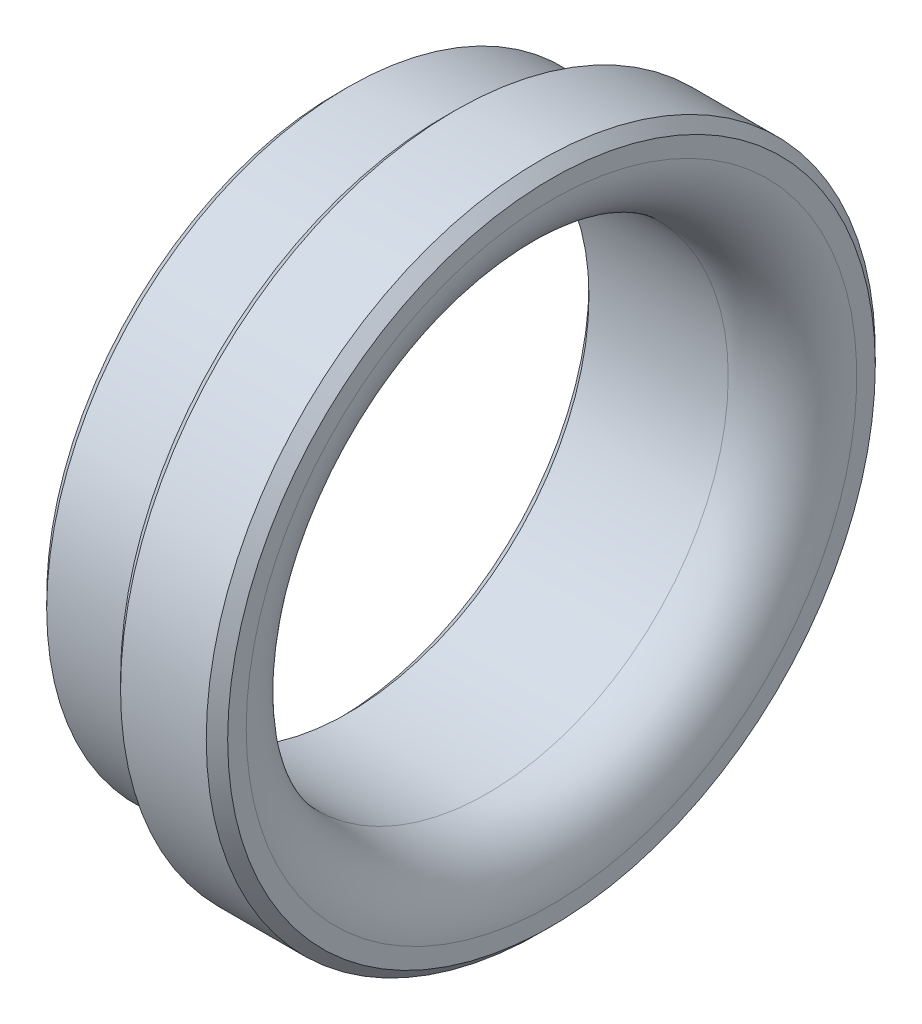
ISO-10303-21;
HEADER;
FILE_DESCRIPTION(('STEP AP214'),'2;1');
FILE_NAME('part.step','',(''),(''),'','','');
FILE_SCHEMA(('AUTOMOTIVE_DESIGN { 1 0 10303 214 1 1 1 1 }'));
ENDSEC;
DATA;
#1=APPLICATION_CONTEXT('core data for automotive mechanical design processes');
#2=APPLICATION_PROTOCOL_DEFINITION('international standard','automotive_design',2000,#1);
#3=PRODUCT_CONTEXT('',#1,'mechanical');
#4=PRODUCT('Part','Part','',(#3));
#5=PRODUCT_RELATED_PRODUCT_CATEGORY('part','',(#4));
#6=PRODUCT_DEFINITION_FORMATION('','',#4);
#7=PRODUCT_DEFINITION_CONTEXT('part definition',#1,'design');
#8=PRODUCT_DEFINITION('design','',#6,#7);
#9=PRODUCT_DEFINITION_SHAPE('','',#8);
#10=(LENGTH_UNIT() NAMED_UNIT(*) SI_UNIT(.MILLI.,.METRE.));
#11=(NAMED_UNIT(*) PLANE_ANGLE_UNIT() SI_UNIT($,.RADIAN.));
#12=(NAMED_UNIT(*) SI_UNIT($,.STERADIAN.) SOLID_ANGLE_UNIT());
#13=UNCERTAINTY_MEASURE_WITH_UNIT(LENGTH_MEASURE(1.E-05),#10,'distance_accuracy_value','');
#14=(GEOMETRIC_REPRESENTATION_CONTEXT(3) GLOBAL_UNCERTAINTY_ASSIGNED_CONTEXT((#13)) GLOBAL_UNIT_ASSIGNED_CONTEXT((#10,
#11,#12)) REPRESENTATION_CONTEXT('',''));
#15=CARTESIAN_POINT('',(0.,0.,0.));
#16=DIRECTION('',(0.,0.,1.));
#17=DIRECTION('',(1.,0.,0.));
#18=AXIS2_PLACEMENT_3D('',#15,#16,#17);
#19=CARTESIAN_POINT('',(-88.99,0.,0.));
#20=DIRECTION('',(-1.,0.,0.));
#21=DIRECTION('',(0.,0.,1.));
#22=AXIS2_PLACEMENT_3D('',#19,#20,#21);
#23=CYLINDRICAL_SURFACE('',#22,28.575);
#24=CARTESIAN_POINT('',(17.78,0.,0.));
#25=DIRECTION('',(-1.,0.,0.));
#26=DIRECTION('',(0.,0.,1.));
#27=AXIS2_PLACEMENT_3D('',#24,#25,#26);
#28=CIRCLE('',#27,28.575);
#29=CARTESIAN_POINT('',(17.78,0.,28.575));
#30=VERTEX_POINT('',#29);
#31=EDGE_CURVE('E10',#30,#30,#28,.F.);
#32=ORIENTED_EDGE('',*,*,#31,.T.);
#33=EDGE_LOOP('',(#32));
#34=FACE_BOUND('',#33,.T.);
#35=CARTESIAN_POINT('',(1.27000000000002,0.,0.));
#36=DIRECTION('',(1.,0.,0.));
#37=DIRECTION('',(0.,0.,-1.));
#38=AXIS2_PLACEMENT_3D('',#35,#36,#37);
#39=CIRCLE('',#38,28.575);
#40=CARTESIAN_POINT('',(1.27000000000002,0.,-28.575));
#41=VERTEX_POINT('',#40);
#42=EDGE_CURVE('E56',#41,#41,#39,.F.);
#43=ORIENTED_EDGE('',*,*,#42,.T.);
#44=EDGE_LOOP('',(#43));
#45=FACE_BOUND('',#44,.T.);
#46=ADVANCED_FACE('F33',(#34,#45),#23,.F.);
#47=CARTESIAN_POINT('',(0.,28.575,0.));
#48=DIRECTION('',(1.,0.,0.));
#49=DIRECTION('',(0.,0.,-1.));
#50=AXIS2_PLACEMENT_3D('',#47,#48,#49);
#51=PLANE('',#50);
#52=CARTESIAN_POINT('',(0.,0.,0.));
#53=DIRECTION('',(1.,0.,0.));
#54=DIRECTION('',(0.,0.,-1.));
#55=AXIS2_PLACEMENT_3D('',#52,#53,#54);
#56=CIRCLE('',#55,29.845);
#57=CARTESIAN_POINT('',(0.,0.,-29.845));
#58=VERTEX_POINT('',#57);
#59=EDGE_CURVE('E48',#58,#58,#56,.T.);
#60=ORIENTED_EDGE('',*,*,#59,.T.);
#61=EDGE_LOOP('',(#60));
#62=FACE_BOUND('',#61,.T.);
#63=CARTESIAN_POINT('',(0.,0.,0.));
#64=DIRECTION('',(1.,0.,0.));
#65=DIRECTION('',(0.,0.,-1.));
#66=AXIS2_PLACEMENT_3D('',#63,#64,#65);
#67=CIRCLE('',#66,34.44875);
#68=CARTESIAN_POINT('',(0.,0.,-34.44875));
#69=VERTEX_POINT('',#68);
#70=EDGE_CURVE('E53',#69,#69,#67,.F.);
#71=ORIENTED_EDGE('',*,*,#70,.T.);
#72=EDGE_LOOP('',(#71));
#73=FACE_BOUND('',#72,.T.);
#74=ADVANCED_FACE('F89',(#62,#73),#51,.F.);
#75=CARTESIAN_POINT('',(-88.99,0.,0.));
#76=DIRECTION('',(-1.,0.,0.));
#77=DIRECTION('',(0.,0.,1.));
#78=AXIS2_PLACEMENT_3D('',#75,#76,#77);
#79=CYLINDRICAL_SURFACE('',#78,35.71875);
#80=CARTESIAN_POINT('',(1.27000000000002,0.,0.));
#81=DIRECTION('',(1.,0.,0.));
#82=DIRECTION('',(0.,0.,-1.));
#83=AXIS2_PLACEMENT_3D('',#80,#81,#82);
#84=CIRCLE('',#83,35.71875);
#85=CARTESIAN_POINT('',(1.27000000000002,0.,-35.71875));
#86=VERTEX_POINT('',#85);
#87=EDGE_CURVE('E44',#86,#86,#84,.T.);
#88=ORIENTED_EDGE('',*,*,#87,.T.);
#89=EDGE_LOOP('',(#88));
#90=FACE_BOUND('',#89,.T.);
#91=CARTESIAN_POINT('',(12.7,0.,0.));
#92=DIRECTION('',(-1.,0.,0.));
#93=DIRECTION('',(0.,0.,1.));
#94=AXIS2_PLACEMENT_3D('',#91,#92,#93);
#95=CIRCLE('',#94,35.71875);
#96=CARTESIAN_POINT('',(12.7,0.,35.71875));
#97=VERTEX_POINT('',#96);
#98=EDGE_CURVE('E71',#97,#97,#95,.T.);
#99=ORIENTED_EDGE('',*,*,#98,.T.);
#100=EDGE_LOOP('',(#99));
#101=FACE_BOUND('',#100,.T.);
#102=ADVANCED_FACE('F75',(#90,#101),#79,.T.);
#103=CARTESIAN_POINT('',(12.7,35.71875,0.));
#104=DIRECTION('',(1.,0.,0.));
#105=DIRECTION('',(0.,0.,-1.));
#106=AXIS2_PLACEMENT_3D('',#103,#104,#105);
#107=PLANE('',#106);
#108=CARTESIAN_POINT('',(12.7,0.,0.));
#109=DIRECTION('',(1.,0.,0.));
#110=DIRECTION('',(0.,0.,-1.));
#111=AXIS2_PLACEMENT_3D('',#108,#109,#110);
#112=CIRCLE('',#111,38.3921);
#113=CARTESIAN_POINT('',(12.7,0.,-38.3921));
#114=VERTEX_POINT('',#113);
#115=EDGE_CURVE('E59',#114,#114,#112,.F.);
#116=ORIENTED_EDGE('',*,*,#115,.T.);
#117=EDGE_LOOP('',(#116));
#118=FACE_BOUND('',#117,.T.);
#119=ORIENTED_EDGE('',*,*,#98,.F.);
#120=EDGE_LOOP('',(#119));
#121=FACE_BOUND('',#120,.T.);
#122=ADVANCED_FACE('F77',(#118,#121),#107,.F.);
#123=CARTESIAN_POINT('',(-88.99,0.,0.));
#124=DIRECTION('',(-1.,0.,0.));
#125=DIRECTION('',(0.,0.,1.));
#126=AXIS2_PLACEMENT_3D('',#123,#124,#125);
#127=CYLINDRICAL_SURFACE('',#126,39.6621);
#128=CARTESIAN_POINT('',(24.13,0.,0.));
#129=DIRECTION('',(-1.,0.,0.));
#130=DIRECTION('',(0.,0.,1.));
#131=AXIS2_PLACEMENT_3D('',#128,#129,#130);
#132=CIRCLE('',#131,39.6621);
#133=CARTESIAN_POINT('',(24.13,0.,39.6621));
#134=VERTEX_POINT('',#133);
#135=EDGE_CURVE('E65',#134,#134,#132,.T.);
#136=ORIENTED_EDGE('',*,*,#135,.T.);
#137=EDGE_LOOP('',(#136));
#138=FACE_BOUND('',#137,.T.);
#139=CARTESIAN_POINT('',(13.97,0.,0.));
#140=DIRECTION('',(1.,0.,0.));
#141=DIRECTION('',(0.,0.,-1.));
#142=AXIS2_PLACEMENT_3D('',#139,#140,#141);
#143=CIRCLE('',#142,39.6621);
#144=CARTESIAN_POINT('',(13.97,0.,-39.6621));
#145=VERTEX_POINT('',#144);
#146=EDGE_CURVE('E68',#145,#145,#143,.T.);
#147=ORIENTED_EDGE('',*,*,#146,.T.);
#148=EDGE_LOOP('',(#147));
#149=FACE_BOUND('',#148,.T.);
#150=ADVANCED_FACE('F79',(#138,#149),#127,.T.);
#151=CARTESIAN_POINT('',(25.4,39.6621,0.));
#152=DIRECTION('',(-1.,0.,0.));
#153=DIRECTION('',(0.,0.,1.));
#154=AXIS2_PLACEMENT_3D('',#151,#152,#153);
#155=PLANE('',#154);
#156=CARTESIAN_POINT('',(25.4,0.,0.));
#157=DIRECTION('',(-1.,0.,0.));
#158=DIRECTION('',(0.,0.,1.));
#159=AXIS2_PLACEMENT_3D('',#156,#157,#158);
#160=CIRCLE('',#159,36.195);
#161=CARTESIAN_POINT('',(25.4,0.,36.195));
#162=VERTEX_POINT('',#161);
#163=EDGE_CURVE('E40',#162,#162,#160,.T.);
#164=ORIENTED_EDGE('',*,*,#163,.T.);
#165=EDGE_LOOP('',(#164));
#166=FACE_BOUND('',#165,.T.);
#167=CARTESIAN_POINT('',(25.4,0.,0.));
#168=DIRECTION('',(-1.,0.,0.));
#169=DIRECTION('',(0.,0.,1.));
#170=AXIS2_PLACEMENT_3D('',#167,#168,#169);
#171=CIRCLE('',#170,38.3921);
#172=CARTESIAN_POINT('',(25.4,0.,38.3921));
#173=VERTEX_POINT('',#172);
#174=EDGE_CURVE('E62',#173,#173,#171,.F.);
#175=ORIENTED_EDGE('',*,*,#174,.T.);
#176=EDGE_LOOP('',(#175));
#177=FACE_BOUND('',#176,.T.);
#178=ADVANCED_FACE('F86',(#166,#177),#155,.F.);
#179=CARTESIAN_POINT('',(24.13,0.,0.));
#180=DIRECTION('',(-1.,0.,0.));
#181=DIRECTION('',(0.,0.,1.));
#182=AXIS2_PLACEMENT_3D('',#179,#180,#181);
#183=CONICAL_SURFACE('',#182,39.6621,0.785398163397451);
#184=ORIENTED_EDGE('',*,*,#174,.F.);
#185=EDGE_LOOP('',(#184));
#186=FACE_BOUND('',#185,.T.);
#187=ORIENTED_EDGE('',*,*,#135,.F.);
#188=EDGE_LOOP('',(#187));
#189=FACE_BOUND('',#188,.T.);
#190=ADVANCED_FACE('F101',(#186,#189),#183,.T.);
#191=CARTESIAN_POINT('',(12.7,0.,0.));
#192=DIRECTION('',(1.,0.,0.));
#193=DIRECTION('',(0.,0.,-1.));
#194=AXIS2_PLACEMENT_3D('',#191,#192,#193);
#195=CONICAL_SURFACE('',#194,38.3921,0.785398163397448);
#196=ORIENTED_EDGE('',*,*,#146,.F.);
#197=EDGE_LOOP('',(#196));
#198=FACE_BOUND('',#197,.T.);
#199=ORIENTED_EDGE('',*,*,#115,.F.);
#200=EDGE_LOOP('',(#199));
#201=FACE_BOUND('',#200,.T.);
#202=ADVANCED_FACE('F104',(#198,#201),#195,.T.);
#203=CARTESIAN_POINT('',(1.27000000000002,0.,0.));
#204=DIRECTION('',(-1.,0.,0.));
#205=DIRECTION('',(0.,0.,1.));
#206=AXIS2_PLACEMENT_3D('',#203,#204,#205);
#207=CONICAL_SURFACE('',#206,28.575,0.785398163397446);
#208=ORIENTED_EDGE('',*,*,#59,.F.);
#209=EDGE_LOOP('',(#208));
#210=FACE_BOUND('',#209,.T.);
#211=ORIENTED_EDGE('',*,*,#42,.F.);
#212=EDGE_LOOP('',(#211));
#213=FACE_BOUND('',#212,.T.);
#214=ADVANCED_FACE('F108',(#210,#213),#207,.F.);
#215=CARTESIAN_POINT('',(0.,0.,0.));
#216=DIRECTION('',(1.,0.,0.));
#217=DIRECTION('',(0.,0.,-1.));
#218=AXIS2_PLACEMENT_3D('',#215,#216,#217);
#219=CONICAL_SURFACE('',#218,34.44875,0.78539816339744);
#220=ORIENTED_EDGE('',*,*,#87,.F.);
#221=EDGE_LOOP('',(#220));
#222=FACE_BOUND('',#221,.T.);
#223=ORIENTED_EDGE('',*,*,#70,.F.);
#224=EDGE_LOOP('',(#223));
#225=FACE_BOUND('',#224,.T.);
#226=ADVANCED_FACE('F111',(#222,#225),#219,.T.);
#227=CARTESIAN_POINT('',(17.78,0.,0.));
#228=DIRECTION('',(-1.,0.,0.));
#229=DIRECTION('',(0.,0.,1.));
#230=AXIS2_PLACEMENT_3D('',#227,#228,#229);
#231=TOROIDAL_SURFACE('',#230,36.195,7.62);
#232=ORIENTED_EDGE('',*,*,#31,.F.);
#233=EDGE_LOOP('',(#232));
#234=FACE_BOUND('',#233,.T.);
#235=ORIENTED_EDGE('',*,*,#163,.F.);
#236=EDGE_LOOP('',(#235));
#237=FACE_BOUND('',#236,.T.);
#238=ADVANCED_FACE('F35',(#234,#237),#231,.T.);
#239=CLOSED_SHELL('',(#46,#74,#102,#122,#150,#178,#190,#202,#214,#226,#238));
#240=MANIFOLD_SOLID_BREP('B2',#239);
#241=ADVANCED_BREP_SHAPE_REPRESENTATION('',(#18,#240),#14);
#242=SHAPE_DEFINITION_REPRESENTATION(#9,#241);
ENDSEC;
END-ISO-10303-21;
